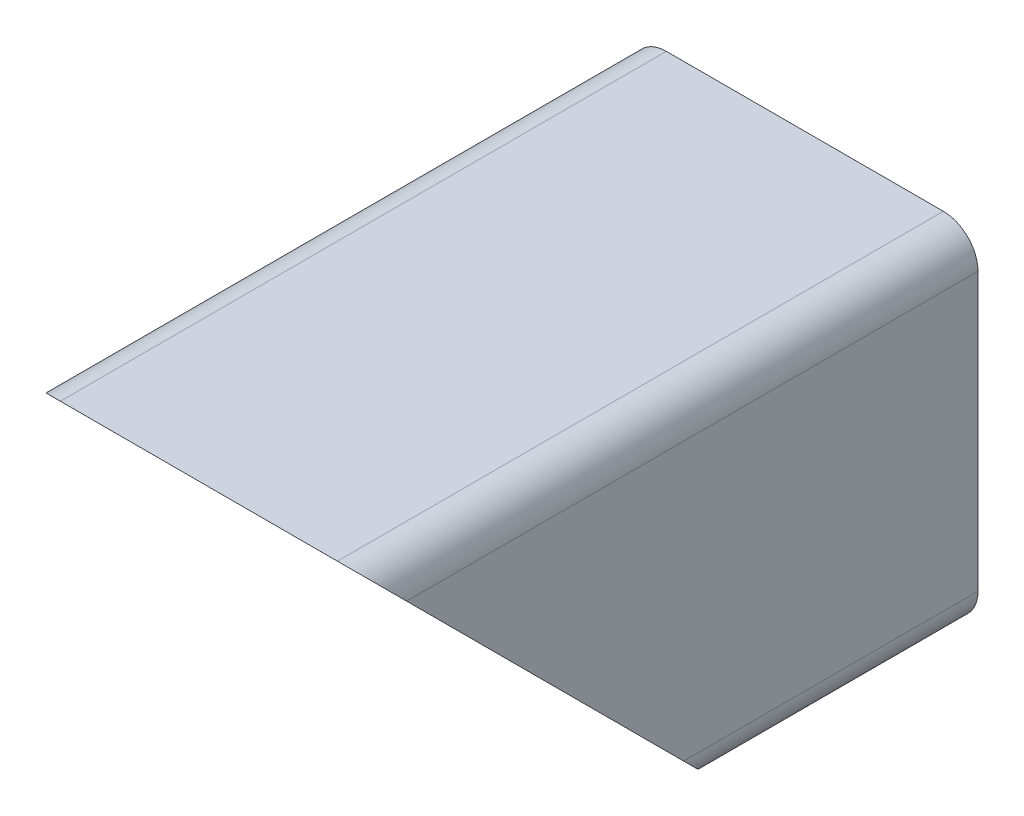
ISO-10303-21;
HEADER;
FILE_DESCRIPTION(('STEP AP214'),'2;1');
FILE_NAME('part.step','',(''),(''),'','','');
FILE_SCHEMA(('AUTOMOTIVE_DESIGN { 1 0 10303 214 1 1 1 1 }'));
ENDSEC;
DATA;
#1=APPLICATION_CONTEXT('core data for automotive mechanical design processes');
#2=APPLICATION_PROTOCOL_DEFINITION('international standard','automotive_design',2000,#1);
#3=PRODUCT_CONTEXT('',#1,'mechanical');
#4=PRODUCT('Part','Part','',(#3));
#5=PRODUCT_RELATED_PRODUCT_CATEGORY('part','',(#4));
#6=PRODUCT_DEFINITION_FORMATION('','',#4);
#7=PRODUCT_DEFINITION_CONTEXT('part definition',#1,'design');
#8=PRODUCT_DEFINITION('design','',#6,#7);
#9=PRODUCT_DEFINITION_SHAPE('','',#8);
#10=(LENGTH_UNIT() NAMED_UNIT(*) SI_UNIT(.MILLI.,.METRE.));
#11=(NAMED_UNIT(*) PLANE_ANGLE_UNIT() SI_UNIT($,.RADIAN.));
#12=(NAMED_UNIT(*) SI_UNIT($,.STERADIAN.) SOLID_ANGLE_UNIT());
#13=UNCERTAINTY_MEASURE_WITH_UNIT(LENGTH_MEASURE(1.E-05),#10,'distance_accuracy_value','');
#14=(GEOMETRIC_REPRESENTATION_CONTEXT(3) GLOBAL_UNCERTAINTY_ASSIGNED_CONTEXT((#13)) GLOBAL_UNIT_ASSIGNED_CONTEXT((#10,
#11,#12)) REPRESENTATION_CONTEXT('',''));
#15=CARTESIAN_POINT('',(0.,0.,0.));
#16=DIRECTION('',(0.,0.,1.));
#17=DIRECTION('',(1.,0.,0.));
#18=AXIS2_PLACEMENT_3D('',#15,#16,#17);
#19=CARTESIAN_POINT('',(16.,-16.,70.));
#20=DIRECTION('',(0.,0.,-1.));
#21=DIRECTION('',(-1.,0.,0.));
#22=AXIS2_PLACEMENT_3D('',#19,#20,#21);
#23=CYLINDRICAL_SURFACE('',#22,4.);
#24=CARTESIAN_POINT('',(16.,-16.,34.0000000000004));
#25=DIRECTION('',(0.,-0.707106781186544,0.707106781186551));
#26=DIRECTION('',(0.,-0.707106781186551,-0.707106781186544));
#27=AXIS2_PLACEMENT_3D('',#24,#25,#26);
#28=ELLIPSE('',#27,5.65685424949235,4.);
#29=CARTESIAN_POINT('',(16.,-20.,30.0000000000004));
#30=VERTEX_POINT('',#29);
#31=CARTESIAN_POINT('',(20.,-16.,34.0000000000004));
#32=VERTEX_POINT('',#31);
#33=EDGE_CURVE('E145',#30,#32,#28,.T.);
#34=ORIENTED_EDGE('',*,*,#33,.F.);
#35=DIRECTION('',(0.,0.,-1.));
#36=VECTOR('',#35,1.);
#37=CARTESIAN_POINT('',(16.,-20.,70.));
#38=LINE('',#37,#36);
#39=CARTESIAN_POINT('',(16.,-20.,0.));
#40=VERTEX_POINT('',#39);
#41=EDGE_CURVE('E155',#30,#40,#38,.T.);
#42=ORIENTED_EDGE('',*,*,#41,.T.);
#43=CARTESIAN_POINT('',(16.,-16.,0.));
#44=DIRECTION('',(0.,0.,1.));
#45=DIRECTION('',(-1.,0.,0.));
#46=AXIS2_PLACEMENT_3D('',#43,#44,#45);
#47=CIRCLE('',#46,4.);
#48=CARTESIAN_POINT('',(20.,-16.,0.));
#49=VERTEX_POINT('',#48);
#50=EDGE_CURVE('E193',#40,#49,#47,.T.);
#51=ORIENTED_EDGE('',*,*,#50,.T.);
#52=DIRECTION('',(0.,0.,-1.));
#53=VECTOR('',#52,1.);
#54=CARTESIAN_POINT('',(20.,-16.,70.));
#55=LINE('',#54,#53);
#56=EDGE_CURVE('E41',#32,#49,#55,.T.);
#57=ORIENTED_EDGE('',*,*,#56,.F.);
#58=EDGE_LOOP('',(#34,#42,#51,#57));
#59=FACE_BOUND('',#58,.T.);
#60=ADVANCED_FACE('F34',(#59),#23,.T.);
#61=CARTESIAN_POINT('',(20.,16.,70.));
#62=DIRECTION('',(-1.,0.,0.));
#63=DIRECTION('',(0.,-1.,0.));
#64=AXIS2_PLACEMENT_3D('',#61,#62,#63);
#65=PLANE('',#64);
#66=DIRECTION('',(0.,0.707106781186551,0.707106781186544));
#67=VECTOR('',#66,1.);
#68=CARTESIAN_POINT('',(20.,18.,68.));
#69=LINE('',#68,#67);
#70=CARTESIAN_POINT('',(20.,16.,66.));
#71=VERTEX_POINT('',#70);
#72=EDGE_CURVE('E158',#32,#71,#69,.T.);
#73=ORIENTED_EDGE('',*,*,#72,.F.);
#74=ORIENTED_EDGE('',*,*,#56,.T.);
#75=DIRECTION('',(0.,1.,0.));
#76=VECTOR('',#75,1.);
#77=CARTESIAN_POINT('',(20.,16.,0.));
#78=LINE('',#77,#76);
#79=CARTESIAN_POINT('',(20.,16.,0.));
#80=VERTEX_POINT('',#79);
#81=EDGE_CURVE('E188',#49,#80,#78,.T.);
#82=ORIENTED_EDGE('',*,*,#81,.T.);
#83=DIRECTION('',(0.,0.,-1.));
#84=VECTOR('',#83,1.);
#85=CARTESIAN_POINT('',(20.,16.,70.));
#86=LINE('',#85,#84);
#87=EDGE_CURVE('E182',#71,#80,#86,.T.);
#88=ORIENTED_EDGE('',*,*,#87,.F.);
#89=EDGE_LOOP('',(#73,#74,#82,#88));
#90=FACE_BOUND('',#89,.T.);
#91=ADVANCED_FACE('F186',(#90),#65,.F.);
#92=CARTESIAN_POINT('',(16.,16.,70.));
#93=DIRECTION('',(0.,0.,-1.));
#94=DIRECTION('',(-1.,0.,0.));
#95=AXIS2_PLACEMENT_3D('',#92,#93,#94);
#96=CYLINDRICAL_SURFACE('',#95,4.);
#97=CARTESIAN_POINT('',(16.,16.,66.));
#98=DIRECTION('',(0.,-0.707106781186544,0.707106781186551));
#99=DIRECTION('',(0.,-0.707106781186551,-0.707106781186544));
#100=AXIS2_PLACEMENT_3D('',#97,#98,#99);
#101=ELLIPSE('',#100,5.65685424949235,4.);
#102=CARTESIAN_POINT('',(16.,20.,70.));
#103=VERTEX_POINT('',#102);
#104=EDGE_CURVE('E235',#71,#103,#101,.T.);
#105=ORIENTED_EDGE('',*,*,#104,.F.);
#106=ORIENTED_EDGE('',*,*,#87,.T.);
#107=CARTESIAN_POINT('',(16.,16.,0.));
#108=DIRECTION('',(0.,0.,1.));
#109=DIRECTION('',(-1.,0.,0.));
#110=AXIS2_PLACEMENT_3D('',#107,#108,#109);
#111=CIRCLE('',#110,4.);
#112=CARTESIAN_POINT('',(16.,20.,0.));
#113=VERTEX_POINT('',#112);
#114=EDGE_CURVE('E195',#80,#113,#111,.T.);
#115=ORIENTED_EDGE('',*,*,#114,.T.);
#116=DIRECTION('',(0.,0.,-1.));
#117=VECTOR('',#116,1.);
#118=CARTESIAN_POINT('',(16.,20.,70.));
#119=LINE('',#118,#117);
#120=EDGE_CURVE('E179',#103,#113,#119,.T.);
#121=ORIENTED_EDGE('',*,*,#120,.F.);
#122=EDGE_LOOP('',(#105,#106,#115,#121));
#123=FACE_BOUND('',#122,.T.);
#124=ADVANCED_FACE('F234',(#123),#96,.T.);
#125=CARTESIAN_POINT('',(-16.,16.,70.));
#126=DIRECTION('',(0.,0.,-1.));
#127=DIRECTION('',(-1.,0.,0.));
#128=AXIS2_PLACEMENT_3D('',#125,#126,#127);
#129=CYLINDRICAL_SURFACE('',#128,4.);
#130=CARTESIAN_POINT('',(-16.,16.,66.));
#131=DIRECTION('',(0.,-0.707106781186544,0.707106781186551));
#132=DIRECTION('',(0.,-0.707106781186551,-0.707106781186544));
#133=AXIS2_PLACEMENT_3D('',#130,#131,#132);
#134=ELLIPSE('',#133,5.65685424949235,4.);
#135=CARTESIAN_POINT('',(-16.,20.,70.));
#136=VERTEX_POINT('',#135);
#137=CARTESIAN_POINT('',(-20.,16.,66.));
#138=VERTEX_POINT('',#137);
#139=EDGE_CURVE('E227',#136,#138,#134,.T.);
#140=ORIENTED_EDGE('',*,*,#139,.F.);
#141=DIRECTION('',(0.,0.,-1.));
#142=VECTOR('',#141,1.);
#143=CARTESIAN_POINT('',(-16.,20.,70.));
#144=LINE('',#143,#142);
#145=CARTESIAN_POINT('',(-16.,20.,0.));
#146=VERTEX_POINT('',#145);
#147=EDGE_CURVE('E176',#136,#146,#144,.T.);
#148=ORIENTED_EDGE('',*,*,#147,.T.);
#149=CARTESIAN_POINT('',(-16.,16.,0.));
#150=DIRECTION('',(0.,0.,1.));
#151=DIRECTION('',(1.,0.,0.));
#152=AXIS2_PLACEMENT_3D('',#149,#150,#151);
#153=CIRCLE('',#152,4.);
#154=CARTESIAN_POINT('',(-20.,16.,0.));
#155=VERTEX_POINT('',#154);
#156=EDGE_CURVE('E205',#146,#155,#153,.T.);
#157=ORIENTED_EDGE('',*,*,#156,.T.);
#158=DIRECTION('',(0.,0.,-1.));
#159=VECTOR('',#158,1.);
#160=CARTESIAN_POINT('',(-20.,16.,70.));
#161=LINE('',#160,#159);
#162=EDGE_CURVE('E174',#138,#155,#161,.T.);
#163=ORIENTED_EDGE('',*,*,#162,.F.);
#164=EDGE_LOOP('',(#140,#148,#157,#163));
#165=FACE_BOUND('',#164,.T.);
#166=ADVANCED_FACE('F225',(#165),#129,.T.);
#167=CARTESIAN_POINT('',(-20.,16.,70.));
#168=DIRECTION('',(1.,0.,0.));
#169=DIRECTION('',(0.,1.,0.));
#170=AXIS2_PLACEMENT_3D('',#167,#168,#169);
#171=PLANE('',#170);
#172=DIRECTION('',(0.,-0.707106781186551,-0.707106781186544));
#173=VECTOR('',#172,1.);
#174=CARTESIAN_POINT('',(-20.,18.,68.));
#175=LINE('',#174,#173);
#176=CARTESIAN_POINT('',(-20.,-16.,34.0000000000004));
#177=VERTEX_POINT('',#176);
#178=EDGE_CURVE('E222',#138,#177,#175,.T.);
#179=ORIENTED_EDGE('',*,*,#178,.F.);
#180=ORIENTED_EDGE('',*,*,#162,.T.);
#181=DIRECTION('',(0.,-1.,0.));
#182=VECTOR('',#181,1.);
#183=CARTESIAN_POINT('',(-20.,16.,0.));
#184=LINE('',#183,#182);
#185=CARTESIAN_POINT('',(-20.,-16.,0.));
#186=VERTEX_POINT('',#185);
#187=EDGE_CURVE('E208',#155,#186,#184,.T.);
#188=ORIENTED_EDGE('',*,*,#187,.T.);
#189=DIRECTION('',(0.,0.,-1.));
#190=VECTOR('',#189,1.);
#191=CARTESIAN_POINT('',(-20.,-16.,70.));
#192=LINE('',#191,#190);
#193=EDGE_CURVE('E167',#177,#186,#192,.T.);
#194=ORIENTED_EDGE('',*,*,#193,.F.);
#195=EDGE_LOOP('',(#179,#180,#188,#194));
#196=FACE_BOUND('',#195,.T.);
#197=ADVANCED_FACE('F220',(#196),#171,.F.);
#198=CARTESIAN_POINT('',(-16.,-16.,70.));
#199=DIRECTION('',(0.,0.,-1.));
#200=DIRECTION('',(-1.,0.,0.));
#201=AXIS2_PLACEMENT_3D('',#198,#199,#200);
#202=CYLINDRICAL_SURFACE('',#201,4.);
#203=CARTESIAN_POINT('',(-16.,-16.,34.0000000000004));
#204=DIRECTION('',(0.,-0.707106781186544,0.707106781186551));
#205=DIRECTION('',(0.,-0.707106781186551,-0.707106781186544));
#206=AXIS2_PLACEMENT_3D('',#203,#204,#205);
#207=ELLIPSE('',#206,5.65685424949236,4.);
#208=CARTESIAN_POINT('',(-16.,-20.,30.0000000000004));
#209=VERTEX_POINT('',#208);
#210=EDGE_CURVE('E48',#177,#209,#207,.T.);
#211=ORIENTED_EDGE('',*,*,#210,.F.);
#212=ORIENTED_EDGE('',*,*,#193,.T.);
#213=CARTESIAN_POINT('',(-16.,-16.,0.));
#214=DIRECTION('',(0.,0.,1.));
#215=DIRECTION('',(1.,0.,0.));
#216=AXIS2_PLACEMENT_3D('',#213,#214,#215);
#217=CIRCLE('',#216,4.);
#218=CARTESIAN_POINT('',(-16.,-20.,0.));
#219=VERTEX_POINT('',#218);
#220=EDGE_CURVE('E210',#186,#219,#217,.T.);
#221=ORIENTED_EDGE('',*,*,#220,.T.);
#222=DIRECTION('',(0.,0.,-1.));
#223=VECTOR('',#222,1.);
#224=CARTESIAN_POINT('',(-16.,-20.,70.));
#225=LINE('',#224,#223);
#226=EDGE_CURVE('E164',#209,#219,#225,.T.);
#227=ORIENTED_EDGE('',*,*,#226,.F.);
#228=EDGE_LOOP('',(#211,#212,#221,#227));
#229=FACE_BOUND('',#228,.T.);
#230=ADVANCED_FACE('F214',(#229),#202,.T.);
#231=CARTESIAN_POINT('',(-16.,-20.,70.));
#232=DIRECTION('',(0.,1.,0.));
#233=DIRECTION('',(0.,0.,1.));
#234=AXIS2_PLACEMENT_3D('',#231,#232,#233);
#235=PLANE('',#234);
#236=DIRECTION('',(-1.,0.,0.));
#237=VECTOR('',#236,1.);
#238=CARTESIAN_POINT('',(41.,-20.,30.0000000000004));
#239=LINE('',#238,#237);
#240=EDGE_CURVE('E142',#30,#209,#239,.T.);
#241=ORIENTED_EDGE('',*,*,#240,.T.);
#242=ORIENTED_EDGE('',*,*,#226,.T.);
#243=DIRECTION('',(1.,0.,0.));
#244=VECTOR('',#243,1.);
#245=CARTESIAN_POINT('',(-16.,-20.,0.));
#246=LINE('',#245,#244);
#247=EDGE_CURVE('E162',#219,#40,#246,.T.);
#248=ORIENTED_EDGE('',*,*,#247,.T.);
#249=ORIENTED_EDGE('',*,*,#41,.F.);
#250=EDGE_LOOP('',(#241,#242,#248,#249));
#251=FACE_BOUND('',#250,.T.);
#252=ADVANCED_FACE('F160',(#251),#235,.F.);
#253=CARTESIAN_POINT('',(-16.,16.,70.));
#254=DIRECTION('',(0.,0.,-1.));
#255=DIRECTION('',(-1.,0.,0.));
#256=AXIS2_PLACEMENT_3D('',#253,#254,#255);
#257=CYLINDRICAL_SURFACE('',#256,2.);
#258=DIRECTION('',(0.,0.,-1.));
#259=VECTOR('',#258,1.);
#260=CARTESIAN_POINT('',(-16.,18.,70.));
#261=LINE('',#260,#259);
#262=CARTESIAN_POINT('',(-16.,18.,68.));
#263=VERTEX_POINT('',#262);
#264=CARTESIAN_POINT('',(-16.,18.,0.));
#265=VERTEX_POINT('',#264);
#266=EDGE_CURVE('E264',#263,#265,#261,.T.);
#267=ORIENTED_EDGE('',*,*,#266,.F.);
#268=CARTESIAN_POINT('',(-16.,16.,66.));
#269=DIRECTION('',(0.,-0.707106781186544,0.707106781186551));
#270=DIRECTION('',(0.,-0.707106781186551,-0.707106781186544));
#271=AXIS2_PLACEMENT_3D('',#268,#269,#270);
#272=ELLIPSE('',#271,2.82842712474617,2.);
#273=CARTESIAN_POINT('',(-18.,16.,66.));
#274=VERTEX_POINT('',#273);
#275=EDGE_CURVE('E56',#263,#274,#272,.T.);
#276=ORIENTED_EDGE('',*,*,#275,.T.);
#277=DIRECTION('',(0.,0.,-1.));
#278=VECTOR('',#277,1.);
#279=CARTESIAN_POINT('',(-18.,16.,70.));
#280=LINE('',#279,#278);
#281=CARTESIAN_POINT('',(-18.,16.,0.));
#282=VERTEX_POINT('',#281);
#283=EDGE_CURVE('E197',#274,#282,#280,.T.);
#284=ORIENTED_EDGE('',*,*,#283,.T.);
#285=CARTESIAN_POINT('',(-16.,16.,0.));
#286=DIRECTION('',(0.,0.,1.));
#287=DIRECTION('',(1.,0.,0.));
#288=AXIS2_PLACEMENT_3D('',#285,#286,#287);
#289=CIRCLE('',#288,2.);
#290=EDGE_CURVE('E157',#265,#282,#289,.T.);
#291=ORIENTED_EDGE('',*,*,#290,.F.);
#292=EDGE_LOOP('',(#267,#276,#284,#291));
#293=FACE_BOUND('',#292,.T.);
#294=ADVANCED_FACE('F293',(#293),#257,.F.);
#295=CARTESIAN_POINT('',(-18.,16.,70.));
#296=DIRECTION('',(1.,0.,0.));
#297=DIRECTION('',(0.,1.,0.));
#298=AXIS2_PLACEMENT_3D('',#295,#296,#297);
#299=PLANE('',#298);
#300=ORIENTED_EDGE('',*,*,#283,.F.);
#301=DIRECTION('',(0.,-0.707106781186551,-0.707106781186544));
#302=VECTOR('',#301,1.);
#303=CARTESIAN_POINT('',(-18.,18.,68.));
#304=LINE('',#303,#302);
#305=CARTESIAN_POINT('',(-18.,-16.,34.0000000000004));
#306=VERTEX_POINT('',#305);
#307=EDGE_CURVE('E283',#274,#306,#304,.T.);
#308=ORIENTED_EDGE('',*,*,#307,.T.);
#309=DIRECTION('',(0.,0.,-1.));
#310=VECTOR('',#309,1.);
#311=CARTESIAN_POINT('',(-18.,-16.,70.));
#312=LINE('',#311,#310);
#313=CARTESIAN_POINT('',(-18.,-16.,0.));
#314=VERTEX_POINT('',#313);
#315=EDGE_CURVE('E199',#306,#314,#312,.T.);
#316=ORIENTED_EDGE('',*,*,#315,.T.);
#317=DIRECTION('',(0.,-1.,0.));
#318=VECTOR('',#317,1.);
#319=CARTESIAN_POINT('',(-18.,16.,0.));
#320=LINE('',#319,#318);
#321=EDGE_CURVE('E243',#282,#314,#320,.T.);
#322=ORIENTED_EDGE('',*,*,#321,.F.);
#323=EDGE_LOOP('',(#300,#308,#316,#322));
#324=FACE_BOUND('',#323,.T.);
#325=ADVANCED_FACE('F282',(#324),#299,.T.);
#326=CARTESIAN_POINT('',(-16.,-16.,70.));
#327=DIRECTION('',(0.,0.,-1.));
#328=DIRECTION('',(-1.,0.,0.));
#329=AXIS2_PLACEMENT_3D('',#326,#327,#328);
#330=CYLINDRICAL_SURFACE('',#329,2.);
#331=ORIENTED_EDGE('',*,*,#315,.F.);
#332=CARTESIAN_POINT('',(-16.,-16.,34.0000000000004));
#333=DIRECTION('',(0.,-0.707106781186544,0.707106781186551));
#334=DIRECTION('',(0.,-0.707106781186551,-0.707106781186544));
#335=AXIS2_PLACEMENT_3D('',#332,#333,#334);
#336=ELLIPSE('',#335,2.82842712474618,2.);
#337=CARTESIAN_POINT('',(-16.,-18.,32.0000000000004));
#338=VERTEX_POINT('',#337);
#339=EDGE_CURVE('E296',#306,#338,#336,.T.);
#340=ORIENTED_EDGE('',*,*,#339,.T.);
#341=DIRECTION('',(0.,0.,-1.));
#342=VECTOR('',#341,1.);
#343=CARTESIAN_POINT('',(-16.,-18.,70.));
#344=LINE('',#343,#342);
#345=CARTESIAN_POINT('',(-16.,-18.,0.));
#346=VERTEX_POINT('',#345);
#347=EDGE_CURVE('E274',#338,#346,#344,.T.);
#348=ORIENTED_EDGE('',*,*,#347,.T.);
#349=CARTESIAN_POINT('',(-16.,-16.,0.));
#350=DIRECTION('',(0.,0.,1.));
#351=DIRECTION('',(1.,0.,0.));
#352=AXIS2_PLACEMENT_3D('',#349,#350,#351);
#353=CIRCLE('',#352,2.);
#354=EDGE_CURVE('E246',#314,#346,#353,.T.);
#355=ORIENTED_EDGE('',*,*,#354,.F.);
#356=EDGE_LOOP('',(#331,#340,#348,#355));
#357=FACE_BOUND('',#356,.T.);
#358=ADVANCED_FACE('F286',(#357),#330,.F.);
#359=CARTESIAN_POINT('',(-16.,-18.,70.));
#360=DIRECTION('',(0.,1.,0.));
#361=DIRECTION('',(0.,0.,1.));
#362=AXIS2_PLACEMENT_3D('',#359,#360,#361);
#363=PLANE('',#362);
#364=ORIENTED_EDGE('',*,*,#347,.F.);
#365=DIRECTION('',(1.,0.,0.));
#366=VECTOR('',#365,1.);
#367=CARTESIAN_POINT('',(-16.,-18.,32.0000000000004));
#368=LINE('',#367,#366);
#369=CARTESIAN_POINT('',(16.,-18.,32.0000000000004));
#370=VERTEX_POINT('',#369);
#371=EDGE_CURVE('E300',#338,#370,#368,.T.);
#372=ORIENTED_EDGE('',*,*,#371,.T.);
#373=DIRECTION('',(0.,0.,-1.));
#374=VECTOR('',#373,1.);
#375=CARTESIAN_POINT('',(16.,-18.,70.));
#376=LINE('',#375,#374);
#377=CARTESIAN_POINT('',(16.,-18.,0.));
#378=VERTEX_POINT('',#377);
#379=EDGE_CURVE('E272',#370,#378,#376,.T.);
#380=ORIENTED_EDGE('',*,*,#379,.T.);
#381=DIRECTION('',(1.,0.,0.));
#382=VECTOR('',#381,1.);
#383=CARTESIAN_POINT('',(-16.,-18.,0.));
#384=LINE('',#383,#382);
#385=EDGE_CURVE('E249',#346,#378,#384,.T.);
#386=ORIENTED_EDGE('',*,*,#385,.F.);
#387=EDGE_LOOP('',(#364,#372,#380,#386));
#388=FACE_BOUND('',#387,.T.);
#389=ADVANCED_FACE('F326',(#388),#363,.T.);
#390=CARTESIAN_POINT('',(16.,-16.,70.));
#391=DIRECTION('',(0.,0.,-1.));
#392=DIRECTION('',(-1.,0.,0.));
#393=AXIS2_PLACEMENT_3D('',#390,#391,#392);
#394=CYLINDRICAL_SURFACE('',#393,2.);
#395=ORIENTED_EDGE('',*,*,#379,.F.);
#396=CARTESIAN_POINT('',(16.,-16.,34.0000000000004));
#397=DIRECTION('',(0.,-0.707106781186544,0.707106781186551));
#398=DIRECTION('',(0.,-0.707106781186551,-0.707106781186544));
#399=AXIS2_PLACEMENT_3D('',#396,#397,#398);
#400=ELLIPSE('',#399,2.82842712474618,2.);
#401=CARTESIAN_POINT('',(18.,-16.,34.0000000000004));
#402=VERTEX_POINT('',#401);
#403=EDGE_CURVE('E303',#370,#402,#400,.T.);
#404=ORIENTED_EDGE('',*,*,#403,.T.);
#405=DIRECTION('',(0.,0.,-1.));
#406=VECTOR('',#405,1.);
#407=CARTESIAN_POINT('',(18.,-16.,70.));
#408=LINE('',#407,#406);
#409=CARTESIAN_POINT('',(18.,-16.,0.));
#410=VERTEX_POINT('',#409);
#411=EDGE_CURVE('E270',#402,#410,#408,.T.);
#412=ORIENTED_EDGE('',*,*,#411,.T.);
#413=CARTESIAN_POINT('',(16.,-16.,0.));
#414=DIRECTION('',(0.,0.,1.));
#415=DIRECTION('',(-1.,0.,0.));
#416=AXIS2_PLACEMENT_3D('',#413,#414,#415);
#417=CIRCLE('',#416,2.);
#418=EDGE_CURVE('E252',#378,#410,#417,.T.);
#419=ORIENTED_EDGE('',*,*,#418,.F.);
#420=EDGE_LOOP('',(#395,#404,#412,#419));
#421=FACE_BOUND('',#420,.T.);
#422=ADVANCED_FACE('F324',(#421),#394,.F.);
#423=CARTESIAN_POINT('',(18.,16.,70.));
#424=DIRECTION('',(-1.,0.,0.));
#425=DIRECTION('',(0.,0.,1.));
#426=AXIS2_PLACEMENT_3D('',#423,#424,#425);
#427=PLANE('',#426);
#428=ORIENTED_EDGE('',*,*,#411,.F.);
#429=DIRECTION('',(0.,0.707106781186551,0.707106781186544));
#430=VECTOR('',#429,1.);
#431=CARTESIAN_POINT('',(18.,18.,68.));
#432=LINE('',#431,#430);
#433=CARTESIAN_POINT('',(18.,16.,66.));
#434=VERTEX_POINT('',#433);
#435=EDGE_CURVE('E306',#402,#434,#432,.T.);
#436=ORIENTED_EDGE('',*,*,#435,.T.);
#437=DIRECTION('',(0.,0.,-1.));
#438=VECTOR('',#437,1.);
#439=CARTESIAN_POINT('',(18.,16.,70.));
#440=LINE('',#439,#438);
#441=CARTESIAN_POINT('',(18.,16.,0.));
#442=VERTEX_POINT('',#441);
#443=EDGE_CURVE('E268',#434,#442,#440,.T.);
#444=ORIENTED_EDGE('',*,*,#443,.T.);
#445=DIRECTION('',(0.,1.,0.));
#446=VECTOR('',#445,1.);
#447=CARTESIAN_POINT('',(18.,16.,0.));
#448=LINE('',#447,#446);
#449=EDGE_CURVE('E255',#410,#442,#448,.T.);
#450=ORIENTED_EDGE('',*,*,#449,.F.);
#451=EDGE_LOOP('',(#428,#436,#444,#450));
#452=FACE_BOUND('',#451,.T.);
#453=ADVANCED_FACE('F321',(#452),#427,.T.);
#454=CARTESIAN_POINT('',(16.,16.,70.));
#455=DIRECTION('',(0.,0.,-1.));
#456=DIRECTION('',(-1.,0.,0.));
#457=AXIS2_PLACEMENT_3D('',#454,#455,#456);
#458=CYLINDRICAL_SURFACE('',#457,2.);
#459=ORIENTED_EDGE('',*,*,#443,.F.);
#460=CARTESIAN_POINT('',(16.,16.,66.));
#461=DIRECTION('',(0.,-0.707106781186544,0.707106781186551));
#462=DIRECTION('',(0.,-0.707106781186551,-0.707106781186544));
#463=AXIS2_PLACEMENT_3D('',#460,#461,#462);
#464=ELLIPSE('',#463,2.82842712474618,2.);
#465=CARTESIAN_POINT('',(16.,18.,68.));
#466=VERTEX_POINT('',#465);
#467=EDGE_CURVE('E150',#434,#466,#464,.T.);
#468=ORIENTED_EDGE('',*,*,#467,.T.);
#469=DIRECTION('',(0.,0.,-1.));
#470=VECTOR('',#469,1.);
#471=CARTESIAN_POINT('',(16.,18.,70.));
#472=LINE('',#471,#470);
#473=CARTESIAN_POINT('',(16.,18.,0.));
#474=VERTEX_POINT('',#473);
#475=EDGE_CURVE('E266',#466,#474,#472,.T.);
#476=ORIENTED_EDGE('',*,*,#475,.T.);
#477=CARTESIAN_POINT('',(16.,16.,0.));
#478=DIRECTION('',(0.,0.,1.));
#479=DIRECTION('',(-1.,0.,0.));
#480=AXIS2_PLACEMENT_3D('',#477,#478,#479);
#481=CIRCLE('',#480,2.);
#482=EDGE_CURVE('E258',#442,#474,#481,.T.);
#483=ORIENTED_EDGE('',*,*,#482,.F.);
#484=EDGE_LOOP('',(#459,#468,#476,#483));
#485=FACE_BOUND('',#484,.T.);
#486=ADVANCED_FACE('F313',(#485),#458,.F.);
#487=CARTESIAN_POINT('',(-16.,18.,70.));
#488=DIRECTION('',(0.,-1.,0.));
#489=DIRECTION('',(0.,0.,-1.));
#490=AXIS2_PLACEMENT_3D('',#487,#488,#489);
#491=PLANE('',#490);
#492=ORIENTED_EDGE('',*,*,#475,.F.);
#493=DIRECTION('',(-1.,0.,0.));
#494=VECTOR('',#493,1.);
#495=CARTESIAN_POINT('',(-16.,18.,68.));
#496=LINE('',#495,#494);
#497=EDGE_CURVE('E11',#466,#263,#496,.T.);
#498=ORIENTED_EDGE('',*,*,#497,.T.);
#499=ORIENTED_EDGE('',*,*,#266,.T.);
#500=DIRECTION('',(-1.,0.,0.));
#501=VECTOR('',#500,1.);
#502=CARTESIAN_POINT('',(-16.,18.,0.));
#503=LINE('',#502,#501);
#504=EDGE_CURVE('E261',#474,#265,#503,.T.);
#505=ORIENTED_EDGE('',*,*,#504,.F.);
#506=EDGE_LOOP('',(#492,#498,#499,#505));
#507=FACE_BOUND('',#506,.T.);
#508=ADVANCED_FACE('F316',(#507),#491,.T.);
#509=CARTESIAN_POINT('',(16.,-16.,0.));
#510=DIRECTION('',(0.,0.,-1.));
#511=DIRECTION('',(-1.,0.,0.));
#512=AXIS2_PLACEMENT_3D('',#509,#510,#511);
#513=PLANE('',#512);
#514=ORIENTED_EDGE('',*,*,#50,.F.);
#515=ORIENTED_EDGE('',*,*,#247,.F.);
#516=ORIENTED_EDGE('',*,*,#220,.F.);
#517=ORIENTED_EDGE('',*,*,#187,.F.);
#518=ORIENTED_EDGE('',*,*,#156,.F.);
#519=DIRECTION('',(-1.,0.,0.));
#520=VECTOR('',#519,1.);
#521=CARTESIAN_POINT('',(-16.,20.,0.));
#522=LINE('',#521,#520);
#523=EDGE_CURVE('E203',#113,#146,#522,.T.);
#524=ORIENTED_EDGE('',*,*,#523,.F.);
#525=ORIENTED_EDGE('',*,*,#114,.F.);
#526=ORIENTED_EDGE('',*,*,#81,.F.);
#527=EDGE_LOOP('',(#514,#515,#516,#517,#518,#524,#525,#526));
#528=FACE_BOUND('',#527,.T.);
#529=ORIENTED_EDGE('',*,*,#504,.T.);
#530=ORIENTED_EDGE('',*,*,#290,.T.);
#531=ORIENTED_EDGE('',*,*,#321,.T.);
#532=ORIENTED_EDGE('',*,*,#354,.T.);
#533=ORIENTED_EDGE('',*,*,#385,.T.);
#534=ORIENTED_EDGE('',*,*,#418,.T.);
#535=ORIENTED_EDGE('',*,*,#449,.T.);
#536=ORIENTED_EDGE('',*,*,#482,.T.);
#537=EDGE_LOOP('',(#529,#530,#531,#532,#533,#534,#535,#536));
#538=FACE_BOUND('',#537,.T.);
#539=ADVANCED_FACE('F191',(#528,#538),#513,.T.);
#540=CARTESIAN_POINT('',(-16.,20.,70.));
#541=DIRECTION('',(0.,-1.,0.));
#542=DIRECTION('',(0.,0.,-1.));
#543=AXIS2_PLACEMENT_3D('',#540,#541,#542);
#544=PLANE('',#543);
#545=ORIENTED_EDGE('',*,*,#523,.T.);
#546=ORIENTED_EDGE('',*,*,#147,.F.);
#547=DIRECTION('',(-1.,0.,0.));
#548=VECTOR('',#547,1.);
#549=CARTESIAN_POINT('',(-16.,20.,70.));
#550=LINE('',#549,#548);
#551=EDGE_CURVE('E165',#103,#136,#550,.T.);
#552=ORIENTED_EDGE('',*,*,#551,.F.);
#553=ORIENTED_EDGE('',*,*,#120,.T.);
#554=EDGE_LOOP('',(#545,#546,#552,#553));
#555=FACE_BOUND('',#554,.T.);
#556=ADVANCED_FACE('F230',(#555),#544,.F.);
#557=CARTESIAN_POINT('',(41.,20.,70.));
#558=DIRECTION('',(0.,-0.707106781186544,0.707106781186551));
#559=DIRECTION('',(0.,-0.707106781186551,-0.707106781186544));
#560=AXIS2_PLACEMENT_3D('',#557,#558,#559);
#561=PLANE('',#560);
#562=ORIENTED_EDGE('',*,*,#497,.F.);
#563=ORIENTED_EDGE('',*,*,#467,.F.);
#564=ORIENTED_EDGE('',*,*,#435,.F.);
#565=ORIENTED_EDGE('',*,*,#403,.F.);
#566=ORIENTED_EDGE('',*,*,#371,.F.);
#567=ORIENTED_EDGE('',*,*,#339,.F.);
#568=ORIENTED_EDGE('',*,*,#307,.F.);
#569=ORIENTED_EDGE('',*,*,#275,.F.);
#570=EDGE_LOOP('',(#562,#563,#564,#565,#566,#567,#568,#569));
#571=FACE_BOUND('',#570,.T.);
#572=ORIENTED_EDGE('',*,*,#33,.T.);
#573=ORIENTED_EDGE('',*,*,#72,.T.);
#574=ORIENTED_EDGE('',*,*,#104,.T.);
#575=ORIENTED_EDGE('',*,*,#551,.T.);
#576=ORIENTED_EDGE('',*,*,#139,.T.);
#577=ORIENTED_EDGE('',*,*,#178,.T.);
#578=ORIENTED_EDGE('',*,*,#210,.T.);
#579=ORIENTED_EDGE('',*,*,#240,.F.);
#580=EDGE_LOOP('',(#572,#573,#574,#575,#576,#577,#578,#579));
#581=FACE_BOUND('',#580,.T.);
#582=ADVANCED_FACE('F144',(#571,#581),#561,.T.);
#583=CLOSED_SHELL('',(#60,#91,#124,#166,#197,#230,#252,#294,#325,#358,#389,#422,#453,#486,#508,
#539,#556,#582));
#584=MANIFOLD_SOLID_BREP('B2',#583);
#585=ADVANCED_BREP_SHAPE_REPRESENTATION('',(#18,#584),#14);
#586=SHAPE_DEFINITION_REPRESENTATION(#9,#585);
ENDSEC;
END-ISO-10303-21;
